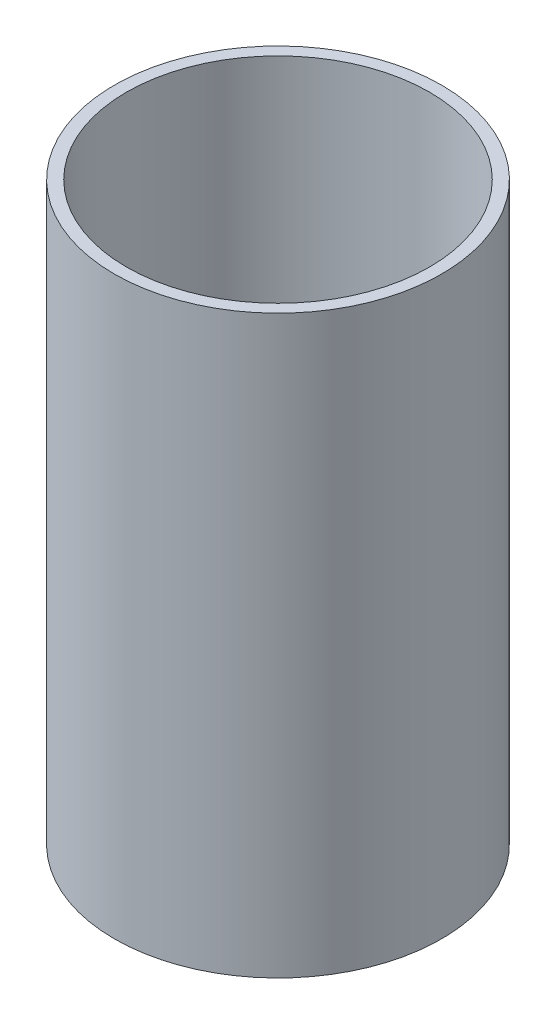
ISO-10303-21;
HEADER;
FILE_DESCRIPTION(('STEP AP214'),'2;1');
FILE_NAME('part.step','',(''),(''),'','','');
FILE_SCHEMA(('AUTOMOTIVE_DESIGN { 1 0 10303 214 1 1 1 1 }'));
ENDSEC;
DATA;
#1=APPLICATION_CONTEXT('core data for automotive mechanical design processes');
#2=APPLICATION_PROTOCOL_DEFINITION('international standard','automotive_design',2000,#1);
#3=PRODUCT_CONTEXT('',#1,'mechanical');
#4=PRODUCT('Part','Part','',(#3));
#5=PRODUCT_RELATED_PRODUCT_CATEGORY('part','',(#4));
#6=PRODUCT_DEFINITION_FORMATION('','',#4);
#7=PRODUCT_DEFINITION_CONTEXT('part definition',#1,'design');
#8=PRODUCT_DEFINITION('design','',#6,#7);
#9=PRODUCT_DEFINITION_SHAPE('','',#8);
#10=(LENGTH_UNIT() NAMED_UNIT(*) SI_UNIT(.MILLI.,.METRE.));
#11=(NAMED_UNIT(*) PLANE_ANGLE_UNIT() SI_UNIT($,.RADIAN.));
#12=(NAMED_UNIT(*) SI_UNIT($,.STERADIAN.) SOLID_ANGLE_UNIT());
#13=UNCERTAINTY_MEASURE_WITH_UNIT(LENGTH_MEASURE(1.E-05),#10,'distance_accuracy_value','');
#14=(GEOMETRIC_REPRESENTATION_CONTEXT(3) GLOBAL_UNCERTAINTY_ASSIGNED_CONTEXT((#13)) GLOBAL_UNIT_ASSIGNED_CONTEXT((#10,
#11,#12)) REPRESENTATION_CONTEXT('',''));
#15=CARTESIAN_POINT('',(0.,0.,0.));
#16=DIRECTION('',(0.,0.,1.));
#17=DIRECTION('',(1.,0.,0.));
#18=AXIS2_PLACEMENT_3D('',#15,#16,#17);
#19=CARTESIAN_POINT('',(0.,48.26,0.));
#20=DIRECTION('',(0.,1.,0.));
#21=DIRECTION('',(0.,0.,1.));
#22=AXIS2_PLACEMENT_3D('',#19,#20,#21);
#23=PLANE('',#22);
#24=CARTESIAN_POINT('',(0.,48.26,0.));
#25=DIRECTION('',(0.,1.,0.));
#26=DIRECTION('',(0.,0.,1.));
#27=AXIS2_PLACEMENT_3D('',#24,#25,#26);
#28=CIRCLE('',#27,13.716);
#29=CARTESIAN_POINT('',(0.,48.26,-13.716));
#30=VERTEX_POINT('',#29);
#31=EDGE_CURVE('E10',#30,#30,#28,.T.);
#32=ORIENTED_EDGE('',*,*,#31,.T.);
#33=EDGE_LOOP('',(#32));
#34=FACE_BOUND('',#33,.T.);
#35=CARTESIAN_POINT('',(0.,48.26,0.));
#36=DIRECTION('',(0.,1.,0.));
#37=DIRECTION('',(0.,0.,1.));
#38=AXIS2_PLACEMENT_3D('',#35,#36,#37);
#39=CIRCLE('',#38,12.7);
#40=CARTESIAN_POINT('',(0.,48.26,-12.7));
#41=VERTEX_POINT('',#40);
#42=EDGE_CURVE('E41',#41,#41,#39,.T.);
#43=ORIENTED_EDGE('',*,*,#42,.F.);
#44=EDGE_LOOP('',(#43));
#45=FACE_BOUND('',#44,.T.);
#46=ADVANCED_FACE('F30',(#34,#45),#23,.T.);
#47=CARTESIAN_POINT('',(0.,0.,0.));
#48=DIRECTION('',(0.,1.,0.));
#49=DIRECTION('',(0.,0.,1.));
#50=AXIS2_PLACEMENT_3D('',#47,#48,#49);
#51=PLANE('',#50);
#52=CARTESIAN_POINT('',(0.,0.,0.));
#53=DIRECTION('',(0.,1.,0.));
#54=DIRECTION('',(0.,0.,1.));
#55=AXIS2_PLACEMENT_3D('',#52,#53,#54);
#56=CIRCLE('',#55,13.716);
#57=CARTESIAN_POINT('',(0.,0.,-13.716));
#58=VERTEX_POINT('',#57);
#59=EDGE_CURVE('E34',#58,#58,#56,.T.);
#60=ORIENTED_EDGE('',*,*,#59,.F.);
#61=EDGE_LOOP('',(#60));
#62=FACE_BOUND('',#61,.T.);
#63=CARTESIAN_POINT('',(0.,0.,0.));
#64=DIRECTION('',(0.,1.,0.));
#65=DIRECTION('',(0.,0.,1.));
#66=AXIS2_PLACEMENT_3D('',#63,#64,#65);
#67=CIRCLE('',#66,12.7);
#68=CARTESIAN_POINT('',(0.,0.,-12.7));
#69=VERTEX_POINT('',#68);
#70=EDGE_CURVE('E43',#69,#69,#67,.T.);
#71=ORIENTED_EDGE('',*,*,#70,.T.);
#72=EDGE_LOOP('',(#71));
#73=FACE_BOUND('',#72,.T.);
#74=ADVANCED_FACE('F53',(#62,#73),#51,.F.);
#75=CARTESIAN_POINT('',(0.,48.26,0.));
#76=DIRECTION('',(0.,-1.,0.));
#77=DIRECTION('',(0.,0.,-1.));
#78=AXIS2_PLACEMENT_3D('',#75,#76,#77);
#79=CYLINDRICAL_SURFACE('',#78,13.716);
#80=CARTESIAN_POINT('',(0.,48.26,-13.716));
#81=CARTESIAN_POINT('',(0.,47.7572916666667,-13.716));
#82=CARTESIAN_POINT('',(0.,47.2545833333333,-13.716));
#83=CARTESIAN_POINT('',(0.,46.2491666666667,-13.716));
#84=CARTESIAN_POINT('',(0.,45.7464583333333,-13.716));
#85=CARTESIAN_POINT('',(0.,44.7410416666667,-13.716));
#86=CARTESIAN_POINT('',(0.,44.2383333333333,-13.716));
#87=CARTESIAN_POINT('',(0.,43.2329166666667,-13.716));
#88=CARTESIAN_POINT('',(0.,42.7302083333333,-13.716));
#89=CARTESIAN_POINT('',(0.,41.7247916666667,-13.716));
#90=CARTESIAN_POINT('',(0.,41.2220833333333,-13.716));
#91=CARTESIAN_POINT('',(0.,40.2166666666667,-13.716));
#92=CARTESIAN_POINT('',(0.,39.7139583333333,-13.716));
#93=CARTESIAN_POINT('',(0.,38.7085416666667,-13.716));
#94=CARTESIAN_POINT('',(0.,38.2058333333333,-13.716));
#95=CARTESIAN_POINT('',(0.,37.2004166666667,-13.716));
#96=CARTESIAN_POINT('',(0.,36.6977083333333,-13.716));
#97=CARTESIAN_POINT('',(0.,35.6922916666667,-13.716));
#98=CARTESIAN_POINT('',(0.,35.1895833333333,-13.716));
#99=CARTESIAN_POINT('',(0.,34.1841666666667,-13.716));
#100=CARTESIAN_POINT('',(0.,33.6814583333333,-13.716));
#101=CARTESIAN_POINT('',(0.,32.6760416666667,-13.716));
#102=CARTESIAN_POINT('',(0.,32.1733333333333,-13.716));
#103=CARTESIAN_POINT('',(0.,31.1679166666667,-13.716));
#104=CARTESIAN_POINT('',(0.,30.6652083333333,-13.716));
#105=CARTESIAN_POINT('',(0.,29.6597916666667,-13.716));
#106=CARTESIAN_POINT('',(0.,29.1570833333333,-13.716));
#107=CARTESIAN_POINT('',(0.,28.1516666666667,-13.716));
#108=CARTESIAN_POINT('',(0.,27.6489583333333,-13.716));
#109=CARTESIAN_POINT('',(0.,26.6435416666667,-13.716));
#110=CARTESIAN_POINT('',(0.,26.1408333333333,-13.716));
#111=CARTESIAN_POINT('',(0.,25.1354166666667,-13.716));
#112=CARTESIAN_POINT('',(0.,24.6327083333333,-13.716));
#113=CARTESIAN_POINT('',(0.,23.6272916666667,-13.716));
#114=CARTESIAN_POINT('',(0.,23.1245833333333,-13.716));
#115=CARTESIAN_POINT('',(0.,22.1191666666667,-13.716));
#116=CARTESIAN_POINT('',(0.,21.6164583333333,-13.716));
#117=CARTESIAN_POINT('',(0.,20.6110416666667,-13.716));
#118=CARTESIAN_POINT('',(0.,20.1083333333333,-13.716));
#119=CARTESIAN_POINT('',(0.,19.1029166666667,-13.716));
#120=CARTESIAN_POINT('',(0.,18.6002083333333,-13.716));
#121=CARTESIAN_POINT('',(0.,17.5947916666667,-13.716));
#122=CARTESIAN_POINT('',(0.,17.0920833333333,-13.716));
#123=CARTESIAN_POINT('',(0.,16.0866666666667,-13.716));
#124=CARTESIAN_POINT('',(0.,15.5839583333333,-13.716));
#125=CARTESIAN_POINT('',(0.,14.5785416666667,-13.716));
#126=CARTESIAN_POINT('',(0.,14.0758333333333,-13.716));
#127=CARTESIAN_POINT('',(0.,13.0704166666667,-13.716));
#128=CARTESIAN_POINT('',(0.,12.5677083333333,-13.716));
#129=CARTESIAN_POINT('',(0.,11.5622916666667,-13.716));
#130=CARTESIAN_POINT('',(0.,11.0595833333333,-13.716));
#131=CARTESIAN_POINT('',(0.,10.0541666666667,-13.716));
#132=CARTESIAN_POINT('',(0.,9.55145833333333,-13.716));
#133=CARTESIAN_POINT('',(0.,8.54604166666666,-13.716));
#134=CARTESIAN_POINT('',(0.,8.04333333333333,-13.716));
#135=CARTESIAN_POINT('',(0.,7.03791666666666,-13.716));
#136=CARTESIAN_POINT('',(0.,6.53520833333333,-13.716));
#137=CARTESIAN_POINT('',(0.,5.52979166666666,-13.716));
#138=CARTESIAN_POINT('',(0.,5.02708333333333,-13.716));
#139=CARTESIAN_POINT('',(0.,4.02166666666666,-13.716));
#140=CARTESIAN_POINT('',(0.,3.51895833333333,-13.716));
#141=CARTESIAN_POINT('',(0.,2.51354166666666,-13.716));
#142=CARTESIAN_POINT('',(0.,2.01083333333333,-13.716));
#143=CARTESIAN_POINT('',(0.,1.00541666666666,-13.716));
#144=CARTESIAN_POINT('',(0.,0.502708333333326,-13.716));
#145=CARTESIAN_POINT('',(0.,0.,-13.716));
#146=B_SPLINE_CURVE_WITH_KNOTS('',3,(#80,#81,#82,#83,#84,#85,#86,#87,#88,#89,#90,#91,#92,#93,
#94,#95,#96,#97,#98,#99,#100,#101,#102,#103,#104,#105,#106,#107,#108,#109,#110,#111,#112,#113,
#114,#115,#116,#117,#118,#119,#120,#121,#122,#123,#124,#125,#126,#127,#128,#129,#130,#131,#132,
#133,#134,#135,#136,#137,#138,#139,#140,#141,#142,#143,#144,#145),.UNSPECIFIED.,.F.,.F.,(4,2,2,
2,2,2,2,2,2,2,2,2,2,2,2,2,2,2,2,2,2,2,2,2,2,2,2,2,2,2,2,2,4),(0.,1.50812500000001,
3.01625000000001,4.524375,6.0325,7.540625,9.04875,10.556875,12.065,13.573125,15.08125,16.589375,
18.0975,19.605625,21.11375,22.621875,24.13,25.638125,27.14625,28.654375,30.1625,31.670625,
33.17875,34.686875,36.195,37.703125,39.21125,40.719375,42.2275,43.735625,45.24375,46.751875,
48.26),.UNSPECIFIED.);
#147=EDGE_CURVE('BSEAM32',#30,#58,#146,.T.);
#148=ORIENTED_EDGE('',*,*,#31,.F.);
#149=ORIENTED_EDGE('',*,*,#59,.T.);
#150=ORIENTED_EDGE('',*,*,#147,.T.);
#151=ORIENTED_EDGE('',*,*,#147,.F.);
#152=EDGE_LOOP('',(#148,#150,#149,#151));
#153=FACE_BOUND('',#152,.T.);
#154=ADVANCED_FACE('F32',(#153),#79,.T.);
#155=CARTESIAN_POINT('',(0.,48.26,0.));
#156=DIRECTION('',(0.,-1.,0.));
#157=DIRECTION('',(0.,0.,-1.));
#158=AXIS2_PLACEMENT_3D('',#155,#156,#157);
#159=CYLINDRICAL_SURFACE('',#158,12.7);
#160=CARTESIAN_POINT('',(0.,48.26,-12.7));
#161=CARTESIAN_POINT('',(0.,47.7572916666667,-12.7));
#162=CARTESIAN_POINT('',(0.,47.2545833333333,-12.7));
#163=CARTESIAN_POINT('',(0.,46.2491666666667,-12.7));
#164=CARTESIAN_POINT('',(0.,45.7464583333333,-12.7));
#165=CARTESIAN_POINT('',(0.,44.7410416666667,-12.7));
#166=CARTESIAN_POINT('',(0.,44.2383333333333,-12.7));
#167=CARTESIAN_POINT('',(0.,43.2329166666667,-12.7));
#168=CARTESIAN_POINT('',(0.,42.7302083333333,-12.7));
#169=CARTESIAN_POINT('',(0.,41.7247916666667,-12.7));
#170=CARTESIAN_POINT('',(0.,41.2220833333333,-12.7));
#171=CARTESIAN_POINT('',(0.,40.2166666666667,-12.7));
#172=CARTESIAN_POINT('',(0.,39.7139583333333,-12.7));
#173=CARTESIAN_POINT('',(0.,38.7085416666667,-12.7));
#174=CARTESIAN_POINT('',(0.,38.2058333333333,-12.7));
#175=CARTESIAN_POINT('',(0.,37.2004166666667,-12.7));
#176=CARTESIAN_POINT('',(0.,36.6977083333333,-12.7));
#177=CARTESIAN_POINT('',(0.,35.6922916666667,-12.7));
#178=CARTESIAN_POINT('',(0.,35.1895833333333,-12.7));
#179=CARTESIAN_POINT('',(0.,34.1841666666667,-12.7));
#180=CARTESIAN_POINT('',(0.,33.6814583333333,-12.7));
#181=CARTESIAN_POINT('',(0.,32.6760416666667,-12.7));
#182=CARTESIAN_POINT('',(0.,32.1733333333333,-12.7));
#183=CARTESIAN_POINT('',(0.,31.1679166666667,-12.7));
#184=CARTESIAN_POINT('',(0.,30.6652083333333,-12.7));
#185=CARTESIAN_POINT('',(0.,29.6597916666667,-12.7));
#186=CARTESIAN_POINT('',(0.,29.1570833333333,-12.7));
#187=CARTESIAN_POINT('',(0.,28.1516666666667,-12.7));
#188=CARTESIAN_POINT('',(0.,27.6489583333333,-12.7));
#189=CARTESIAN_POINT('',(0.,26.6435416666667,-12.7));
#190=CARTESIAN_POINT('',(0.,26.1408333333333,-12.7));
#191=CARTESIAN_POINT('',(0.,25.1354166666667,-12.7));
#192=CARTESIAN_POINT('',(0.,24.6327083333333,-12.7));
#193=CARTESIAN_POINT('',(0.,23.6272916666667,-12.7));
#194=CARTESIAN_POINT('',(0.,23.1245833333333,-12.7));
#195=CARTESIAN_POINT('',(0.,22.1191666666667,-12.7));
#196=CARTESIAN_POINT('',(0.,21.6164583333333,-12.7));
#197=CARTESIAN_POINT('',(0.,20.6110416666667,-12.7));
#198=CARTESIAN_POINT('',(0.,20.1083333333333,-12.7));
#199=CARTESIAN_POINT('',(0.,19.1029166666667,-12.7));
#200=CARTESIAN_POINT('',(0.,18.6002083333333,-12.7));
#201=CARTESIAN_POINT('',(0.,17.5947916666667,-12.7));
#202=CARTESIAN_POINT('',(0.,17.0920833333333,-12.7));
#203=CARTESIAN_POINT('',(0.,16.0866666666667,-12.7));
#204=CARTESIAN_POINT('',(0.,15.5839583333333,-12.7));
#205=CARTESIAN_POINT('',(0.,14.5785416666667,-12.7));
#206=CARTESIAN_POINT('',(0.,14.0758333333333,-12.7));
#207=CARTESIAN_POINT('',(0.,13.0704166666667,-12.7));
#208=CARTESIAN_POINT('',(0.,12.5677083333333,-12.7));
#209=CARTESIAN_POINT('',(0.,11.5622916666667,-12.7));
#210=CARTESIAN_POINT('',(0.,11.0595833333333,-12.7));
#211=CARTESIAN_POINT('',(0.,10.0541666666667,-12.7));
#212=CARTESIAN_POINT('',(0.,9.55145833333333,-12.7));
#213=CARTESIAN_POINT('',(0.,8.54604166666666,-12.7));
#214=CARTESIAN_POINT('',(0.,8.04333333333333,-12.7));
#215=CARTESIAN_POINT('',(0.,7.03791666666666,-12.7));
#216=CARTESIAN_POINT('',(0.,6.53520833333333,-12.7));
#217=CARTESIAN_POINT('',(0.,5.52979166666666,-12.7));
#218=CARTESIAN_POINT('',(0.,5.02708333333333,-12.7));
#219=CARTESIAN_POINT('',(0.,4.02166666666666,-12.7));
#220=CARTESIAN_POINT('',(0.,3.51895833333332,-12.7));
#221=CARTESIAN_POINT('',(0.,2.51354166666666,-12.7));
#222=CARTESIAN_POINT('',(0.,2.01083333333333,-12.7));
#223=CARTESIAN_POINT('',(0.,1.00541666666666,-12.7));
#224=CARTESIAN_POINT('',(0.,0.502708333333326,-12.7));
#225=CARTESIAN_POINT('',(0.,0.,-12.7));
#226=B_SPLINE_CURVE_WITH_KNOTS('',3,(#160,#161,#162,#163,#164,#165,#166,#167,#168,#169,#170,
#171,#172,#173,#174,#175,#176,#177,#178,#179,#180,#181,#182,#183,#184,#185,#186,#187,#188,#189,
#190,#191,#192,#193,#194,#195,#196,#197,#198,#199,#200,#201,#202,#203,#204,#205,#206,#207,#208,
#209,#210,#211,#212,#213,#214,#215,#216,#217,#218,#219,#220,#221,#222,#223,#224,#225),
.UNSPECIFIED.,.F.,.F.,(4,2,2,2,2,2,2,2,2,2,2,2,2,2,2,2,2,2,2,2,2,2,2,2,2,2,2,2,2,2,2,2,4),(0.,
1.508125,3.01625,4.524375,6.0325,7.540625,9.04874999999999,10.556875,12.065,13.573125,15.08125,
16.589375,18.0975,19.605625,21.11375,22.621875,24.13,25.638125,27.14625,28.654375,30.1625,
31.670625,33.17875,34.686875,36.195,37.703125,39.21125,40.719375,42.2275,43.735625,45.24375,
46.751875,48.26),.UNSPECIFIED.);
#227=EDGE_CURVE('BSEAM49',#41,#69,#226,.T.);
#228=ORIENTED_EDGE('',*,*,#42,.T.);
#229=ORIENTED_EDGE('',*,*,#70,.F.);
#230=ORIENTED_EDGE('',*,*,#227,.T.);
#231=ORIENTED_EDGE('',*,*,#227,.F.);
#232=EDGE_LOOP('',(#228,#230,#229,#231));
#233=FACE_BOUND('',#232,.T.);
#234=ADVANCED_FACE('F49',(#233),#159,.F.);
#235=CLOSED_SHELL('',(#46,#74,#154,#234));
#236=MANIFOLD_SOLID_BREP('B2',#235);
#237=ADVANCED_BREP_SHAPE_REPRESENTATION('',(#18,#236),#14);
#238=SHAPE_DEFINITION_REPRESENTATION(#9,#237);
ENDSEC;
END-ISO-10303-21;
